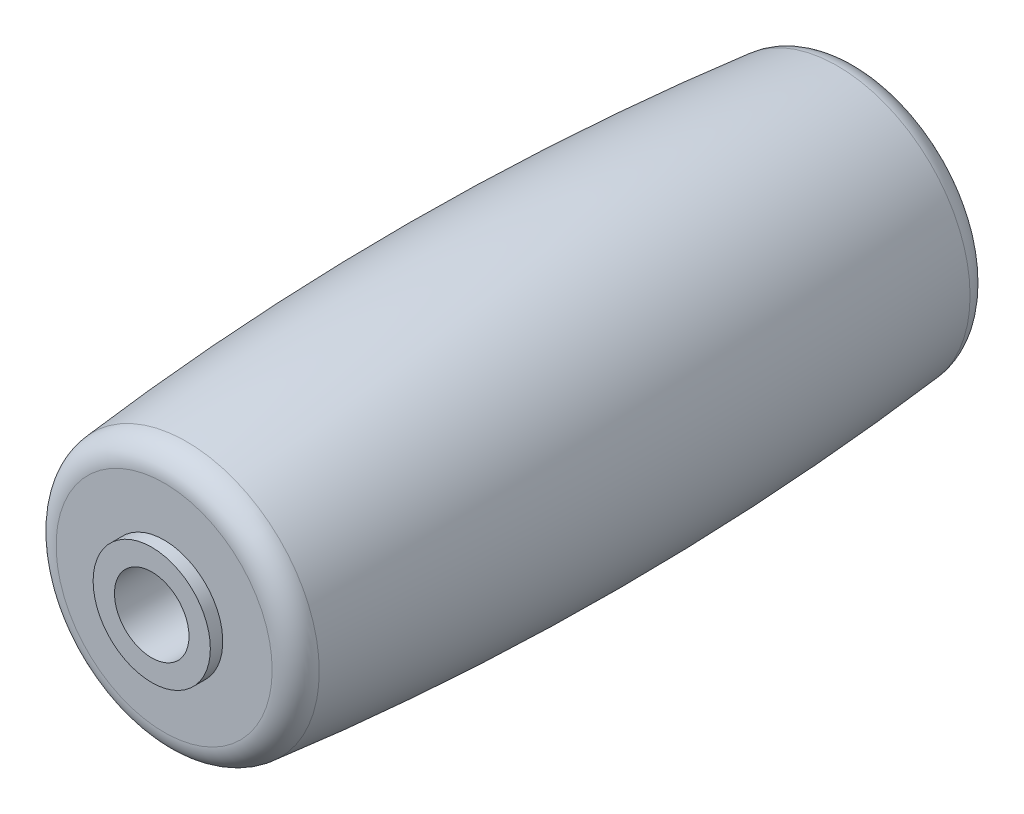
ISO-10303-21;
HEADER;
FILE_DESCRIPTION(('STEP AP214'),'2;1');
FILE_NAME('part.step','',(''),(''),'','','');
FILE_SCHEMA(('AUTOMOTIVE_DESIGN { 1 0 10303 214 1 1 1 1 }'));
ENDSEC;
DATA;
#1=APPLICATION_CONTEXT('core data for automotive mechanical design processes');
#2=APPLICATION_PROTOCOL_DEFINITION('international standard','automotive_design',2000,#1);
#3=PRODUCT_CONTEXT('',#1,'mechanical');
#4=PRODUCT('Part','Part','',(#3));
#5=PRODUCT_RELATED_PRODUCT_CATEGORY('part','',(#4));
#6=PRODUCT_DEFINITION_FORMATION('','',#4);
#7=PRODUCT_DEFINITION_CONTEXT('part definition',#1,'design');
#8=PRODUCT_DEFINITION('design','',#6,#7);
#9=PRODUCT_DEFINITION_SHAPE('','',#8);
#10=(LENGTH_UNIT() NAMED_UNIT(*) SI_UNIT(.MILLI.,.METRE.));
#11=(NAMED_UNIT(*) PLANE_ANGLE_UNIT() SI_UNIT($,.RADIAN.));
#12=(NAMED_UNIT(*) SI_UNIT($,.STERADIAN.) SOLID_ANGLE_UNIT());
#13=UNCERTAINTY_MEASURE_WITH_UNIT(LENGTH_MEASURE(1.E-05),#10,'distance_accuracy_value','');
#14=(GEOMETRIC_REPRESENTATION_CONTEXT(3) GLOBAL_UNCERTAINTY_ASSIGNED_CONTEXT((#13)) GLOBAL_UNIT_ASSIGNED_CONTEXT((#10,
#11,#12)) REPRESENTATION_CONTEXT('',''));
#15=CARTESIAN_POINT('',(0.,0.,0.));
#16=DIRECTION('',(0.,0.,1.));
#17=DIRECTION('',(1.,0.,0.));
#18=AXIS2_PLACEMENT_3D('',#15,#16,#17);
#19=CARTESIAN_POINT('',(0.,0.,-18.2426406871193));
#20=DIRECTION('',(0.,0.,1.));
#21=DIRECTION('',(1.,0.,0.));
#22=AXIS2_PLACEMENT_3D('',#19,#20,#21);
#23=CYLINDRICAL_SURFACE('',#22,1.5);
#24=CARTESIAN_POINT('',(0.,0.,14.5));
#25=DIRECTION('',(0.,0.,1.));
#26=DIRECTION('',(1.,0.,0.));
#27=AXIS2_PLACEMENT_3D('',#24,#25,#26);
#28=CIRCLE('',#27,1.5);
#29=CARTESIAN_POINT('',(1.5,0.,14.5));
#30=VERTEX_POINT('',#29);
#31=EDGE_CURVE('E66',#30,#30,#28,.F.);
#32=ORIENTED_EDGE('',*,*,#31,.F.);
#33=EDGE_LOOP('',(#32));
#34=FACE_BOUND('',#33,.T.);
#35=CARTESIAN_POINT('',(0.,0.,-14.5));
#36=DIRECTION('',(0.,0.,1.));
#37=DIRECTION('',(1.,0.,0.));
#38=AXIS2_PLACEMENT_3D('',#35,#36,#37);
#39=CIRCLE('',#38,1.5);
#40=CARTESIAN_POINT('',(1.5,0.,-14.5));
#41=VERTEX_POINT('',#40);
#42=EDGE_CURVE('E73',#41,#41,#39,.F.);
#43=ORIENTED_EDGE('',*,*,#42,.T.);
#44=EDGE_LOOP('',(#43));
#45=FACE_BOUND('',#44,.T.);
#46=ADVANCED_FACE('F40',(#34,#45),#23,.F.);
#47=CARTESIAN_POINT('',(0.,0.,-14.));
#48=DIRECTION('',(0.,0.,1.));
#49=DIRECTION('',(1.,0.,0.));
#50=AXIS2_PLACEMENT_3D('',#47,#48,#49);
#51=PLANE('',#50);
#52=CARTESIAN_POINT('',(0.,0.,-14.));
#53=DIRECTION('',(0.,0.,1.));
#54=DIRECTION('',(1.,0.,0.));
#55=AXIS2_PLACEMENT_3D('',#52,#53,#54);
#56=CIRCLE('',#55,2.35954080589735);
#57=CARTESIAN_POINT('',(2.35954080589735,0.,-14.));
#58=VERTEX_POINT('',#57);
#59=EDGE_CURVE('E70',#58,#58,#56,.T.);
#60=ORIENTED_EDGE('',*,*,#59,.T.);
#61=EDGE_LOOP('',(#60));
#62=FACE_BOUND('',#61,.T.);
#63=CARTESIAN_POINT('',(0.,0.,-14.));
#64=DIRECTION('',(0.,0.,1.));
#65=DIRECTION('',(1.,0.,0.));
#66=AXIS2_PLACEMENT_3D('',#63,#64,#65);
#67=CIRCLE('',#66,4.34857666506394);
#68=CARTESIAN_POINT('',(4.34857666506394,0.,-14.));
#69=VERTEX_POINT('',#68);
#70=EDGE_CURVE('E47',#69,#69,#67,.T.);
#71=ORIENTED_EDGE('',*,*,#70,.F.);
#72=EDGE_LOOP('',(#71));
#73=FACE_BOUND('',#72,.T.);
#74=ADVANCED_FACE('F42',(#62,#73),#51,.F.);
#75=CARTESIAN_POINT('',(0.,0.,-13.));
#76=DIRECTION('',(0.,0.,1.));
#77=DIRECTION('',(1.,0.,0.));
#78=AXIS2_PLACEMENT_3D('',#75,#76,#77);
#79=TOROIDAL_SURFACE('',#78,4.34857666506394,0.999999999999971);
#80=CARTESIAN_POINT('',(0.,0.,-13.0999679589875));
#81=DIRECTION('',(0.,0.,1.));
#82=DIRECTION('',(1.,0.,0.));
#83=AXIS2_PLACEMENT_3D('',#80,#81,#82);
#84=CIRCLE('',#83,5.34356732189231);
#85=CARTESIAN_POINT('',(5.34356732189231,0.,-13.0999679589875));
#86=VERTEX_POINT('',#85);
#87=EDGE_CURVE('E51',#86,#86,#84,.T.);
#88=ORIENTED_EDGE('',*,*,#87,.F.);
#89=EDGE_LOOP('',(#88));
#90=FACE_BOUND('',#89,.T.);
#91=ORIENTED_EDGE('',*,*,#70,.T.);
#92=EDGE_LOOP('',(#91));
#93=FACE_BOUND('',#92,.T.);
#94=ADVANCED_FACE('F95',(#90,#93),#79,.T.);
#95=CARTESIAN_POINT('',(0.,0.,0.));
#96=DIRECTION('',(0.,0.,1.));
#97=DIRECTION('',(1.,0.,0.));
#98=AXIS2_PLACEMENT_3D('',#95,#96,#97);
#99=DEGENERATE_TOROIDAL_SURFACE('',#98,125.041666666667,131.041666666667,.F.);
#100=CARTESIAN_POINT('',(0.,0.,13.0999679589875));
#101=DIRECTION('',(0.,0.,1.));
#102=DIRECTION('',(1.,0.,0.));
#103=AXIS2_PLACEMENT_3D('',#100,#101,#102);
#104=CIRCLE('',#103,5.34356732189234);
#105=CARTESIAN_POINT('',(5.34356732189234,0.,13.0999679589875));
#106=VERTEX_POINT('',#105);
#107=EDGE_CURVE('E55',#106,#106,#104,.T.);
#108=ORIENTED_EDGE('',*,*,#107,.F.);
#109=EDGE_LOOP('',(#108));
#110=FACE_BOUND('',#109,.T.);
#111=ORIENTED_EDGE('',*,*,#87,.T.);
#112=EDGE_LOOP('',(#111));
#113=FACE_BOUND('',#112,.T.);
#114=ADVANCED_FACE('F100',(#110,#113),#99,.F.);
#115=CARTESIAN_POINT('',(0.,0.,13.));
#116=DIRECTION('',(0.,0.,1.));
#117=DIRECTION('',(1.,0.,0.));
#118=AXIS2_PLACEMENT_3D('',#115,#116,#117);
#119=TOROIDAL_SURFACE('',#118,4.34857666506394,0.999999999999971);
#120=CARTESIAN_POINT('',(0.,0.,14.));
#121=DIRECTION('',(0.,0.,1.));
#122=DIRECTION('',(1.,0.,0.));
#123=AXIS2_PLACEMENT_3D('',#120,#121,#122);
#124=CIRCLE('',#123,4.34857666506394);
#125=CARTESIAN_POINT('',(4.34857666506394,0.,14.));
#126=VERTEX_POINT('',#125);
#127=EDGE_CURVE('E60',#126,#126,#124,.T.);
#128=ORIENTED_EDGE('',*,*,#127,.F.);
#129=EDGE_LOOP('',(#128));
#130=FACE_BOUND('',#129,.T.);
#131=ORIENTED_EDGE('',*,*,#107,.T.);
#132=EDGE_LOOP('',(#131));
#133=FACE_BOUND('',#132,.T.);
#134=ADVANCED_FACE('F114',(#130,#133),#119,.T.);
#135=CARTESIAN_POINT('',(0.,4.34857666506394,14.));
#136=DIRECTION('',(0.,0.,-1.));
#137=DIRECTION('',(-1.,0.,0.));
#138=AXIS2_PLACEMENT_3D('',#135,#136,#137);
#139=PLANE('',#138);
#140=CARTESIAN_POINT('',(0.,0.,14.));
#141=DIRECTION('',(0.,0.,-1.));
#142=DIRECTION('',(-1.,0.,0.));
#143=AXIS2_PLACEMENT_3D('',#140,#141,#142);
#144=CIRCLE('',#143,2.35954080589735);
#145=CARTESIAN_POINT('',(-2.35954080589735,0.,14.));
#146=VERTEX_POINT('',#145);
#147=EDGE_CURVE('E10',#146,#146,#144,.F.);
#148=ORIENTED_EDGE('',*,*,#147,.F.);
#149=EDGE_LOOP('',(#148));
#150=FACE_BOUND('',#149,.T.);
#151=ORIENTED_EDGE('',*,*,#127,.T.);
#152=EDGE_LOOP('',(#151));
#153=FACE_BOUND('',#152,.T.);
#154=ADVANCED_FACE('F111',(#150,#153),#139,.F.);
#155=CARTESIAN_POINT('',(0.,0.,14.5));
#156=DIRECTION('',(0.,0.,-1.));
#157=DIRECTION('',(-1.,0.,0.));
#158=AXIS2_PLACEMENT_3D('',#155,#156,#157);
#159=CYLINDRICAL_SURFACE('',#158,2.35954080589735);
#160=CARTESIAN_POINT('',(0.,0.,14.5));
#161=DIRECTION('',(0.,0.,1.));
#162=DIRECTION('',(1.,0.,0.));
#163=AXIS2_PLACEMENT_3D('',#160,#161,#162);
#164=CIRCLE('',#163,2.35954080589735);
#165=CARTESIAN_POINT('',(2.35954080589735,0.,14.5));
#166=VERTEX_POINT('',#165);
#167=EDGE_CURVE('E63',#166,#166,#164,.T.);
#168=ORIENTED_EDGE('',*,*,#167,.F.);
#169=EDGE_LOOP('',(#168));
#170=FACE_BOUND('',#169,.T.);
#171=ORIENTED_EDGE('',*,*,#147,.T.);
#172=EDGE_LOOP('',(#171));
#173=FACE_BOUND('',#172,.T.);
#174=ADVANCED_FACE('F109',(#170,#173),#159,.T.);
#175=CARTESIAN_POINT('',(0.,0.,14.5));
#176=DIRECTION('',(0.,0.,1.));
#177=DIRECTION('',(1.,0.,0.));
#178=AXIS2_PLACEMENT_3D('',#175,#176,#177);
#179=PLANE('',#178);
#180=ORIENTED_EDGE('',*,*,#31,.T.);
#181=EDGE_LOOP('',(#180));
#182=FACE_BOUND('',#181,.T.);
#183=ORIENTED_EDGE('',*,*,#167,.T.);
#184=EDGE_LOOP('',(#183));
#185=FACE_BOUND('',#184,.T.);
#186=ADVANCED_FACE('F89',(#182,#185),#179,.T.);
#187=CARTESIAN_POINT('',(0.,0.,-14.5));
#188=DIRECTION('',(0.,0.,1.));
#189=DIRECTION('',(1.,0.,0.));
#190=AXIS2_PLACEMENT_3D('',#187,#188,#189);
#191=CYLINDRICAL_SURFACE('',#190,2.35954080589735);
#192=CARTESIAN_POINT('',(0.,0.,-14.5));
#193=DIRECTION('',(0.,0.,1.));
#194=DIRECTION('',(1.,0.,0.));
#195=AXIS2_PLACEMENT_3D('',#192,#193,#194);
#196=CIRCLE('',#195,2.35954080589735);
#197=CARTESIAN_POINT('',(2.35954080589735,0.,-14.5));
#198=VERTEX_POINT('',#197);
#199=EDGE_CURVE('E69',#198,#198,#196,.T.);
#200=ORIENTED_EDGE('',*,*,#199,.T.);
#201=EDGE_LOOP('',(#200));
#202=FACE_BOUND('',#201,.T.);
#203=ORIENTED_EDGE('',*,*,#59,.F.);
#204=EDGE_LOOP('',(#203));
#205=FACE_BOUND('',#204,.T.);
#206=ADVANCED_FACE('F83',(#202,#205),#191,.T.);
#207=CARTESIAN_POINT('',(0.,0.,-14.5));
#208=DIRECTION('',(0.,0.,-1.));
#209=DIRECTION('',(1.,0.,0.));
#210=AXIS2_PLACEMENT_3D('',#207,#208,#209);
#211=PLANE('',#210);
#212=ORIENTED_EDGE('',*,*,#42,.F.);
#213=EDGE_LOOP('',(#212));
#214=FACE_BOUND('',#213,.T.);
#215=ORIENTED_EDGE('',*,*,#199,.F.);
#216=EDGE_LOOP('',(#215));
#217=FACE_BOUND('',#216,.T.);
#218=ADVANCED_FACE('F80',(#214,#217),#211,.T.);
#219=CLOSED_SHELL('',(#46,#74,#94,#114,#134,#154,#174,#186,#206,#218));
#220=MANIFOLD_SOLID_BREP('B2',#219);
#221=ADVANCED_BREP_SHAPE_REPRESENTATION('',(#18,#220),#14);
#222=SHAPE_DEFINITION_REPRESENTATION(#9,#221);
ENDSEC;
END-ISO-10303-21;
